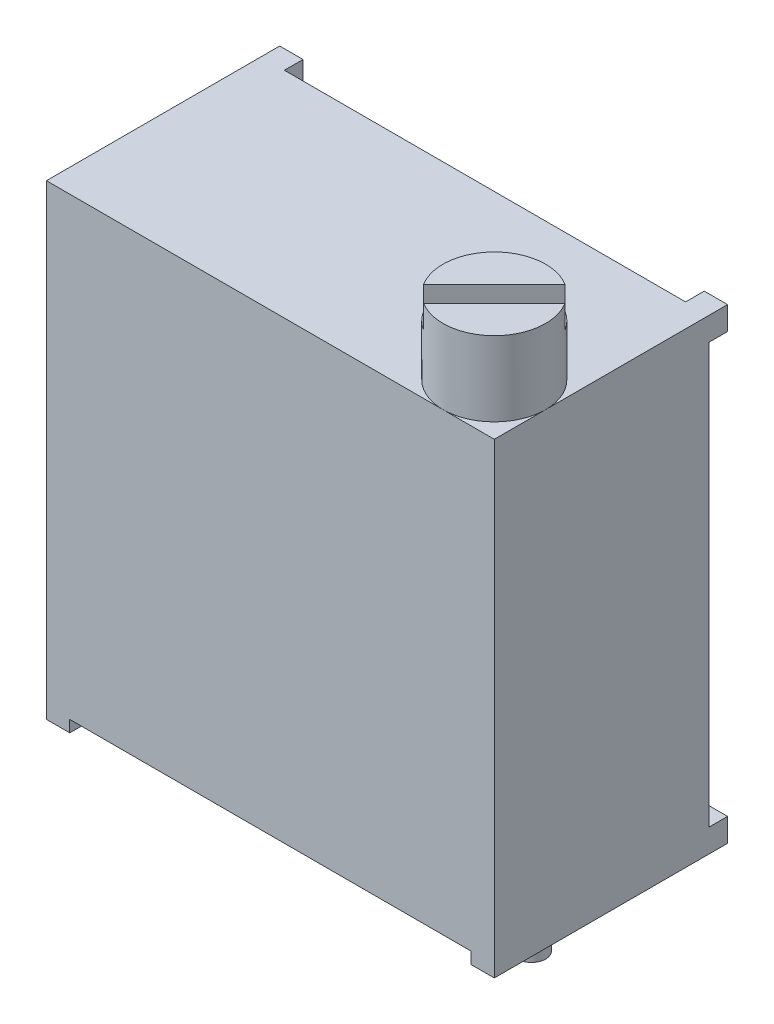
ISO-10303-21;
HEADER;
FILE_DESCRIPTION(('STEP AP214'),'2;1');
FILE_NAME('part.step','',(''),(''),'','','');
FILE_SCHEMA(('AUTOMOTIVE_DESIGN { 1 0 10303 214 1 1 1 1 }'));
ENDSEC;
DATA;
#1=APPLICATION_CONTEXT('core data for automotive mechanical design processes');
#2=APPLICATION_PROTOCOL_DEFINITION('international standard','automotive_design',2000,#1);
#3=PRODUCT_CONTEXT('',#1,'mechanical');
#4=PRODUCT('Part','Part','',(#3));
#5=PRODUCT_RELATED_PRODUCT_CATEGORY('part','',(#4));
#6=PRODUCT_DEFINITION_FORMATION('','',#4);
#7=PRODUCT_DEFINITION_CONTEXT('part definition',#1,'design');
#8=PRODUCT_DEFINITION('design','',#6,#7);
#9=PRODUCT_DEFINITION_SHAPE('','',#8);
#10=(LENGTH_UNIT() NAMED_UNIT(*) SI_UNIT(.MILLI.,.METRE.));
#11=(NAMED_UNIT(*) PLANE_ANGLE_UNIT() SI_UNIT($,.RADIAN.));
#12=(NAMED_UNIT(*) SI_UNIT($,.STERADIAN.) SOLID_ANGLE_UNIT());
#13=UNCERTAINTY_MEASURE_WITH_UNIT(LENGTH_MEASURE(1.E-05),#10,'distance_accuracy_value','');
#14=(GEOMETRIC_REPRESENTATION_CONTEXT(3) GLOBAL_UNCERTAINTY_ASSIGNED_CONTEXT((#13)) GLOBAL_UNIT_ASSIGNED_CONTEXT((#10,
#11,#12)) REPRESENTATION_CONTEXT('',''));
#15=CARTESIAN_POINT('',(0.,0.,0.));
#16=DIRECTION('',(0.,0.,1.));
#17=DIRECTION('',(1.,0.,0.));
#18=AXIS2_PLACEMENT_3D('',#15,#16,#17);
#19=CARTESIAN_POINT('',(0.165760434326159,11.1,2.48068617508052));
#20=DIRECTION('',(-0.707106781186548,0.,-0.707106781186547));
#21=DIRECTION('',(-0.707106781186547,0.,0.707106781186548));
#22=AXIS2_PLACEMENT_3D('',#19,#20,#21);
#23=PLANE('',#22);
#24=DIRECTION('',(0.,1.,0.));
#25=VECTOR('',#24,1.);
#26=CARTESIAN_POINT('',(0.165760434326159,11.1,2.48068617508052));
#27=LINE('',#26,#25);
#28=CARTESIAN_POINT('',(0.165760434326159,11.1,2.48068617508052));
#29=VERTEX_POINT('',#28);
#30=CARTESIAN_POINT('',(0.165760434326159,11.6,2.48068617508052));
#31=VERTEX_POINT('',#30);
#32=EDGE_CURVE('P0_E55',#29,#31,#27,.T.);
#33=ORIENTED_EDGE('',*,*,#32,.F.);
#34=DIRECTION('',(-0.707106781186547,0.,0.707106781186548));
#35=VECTOR('',#34,1.);
#36=CARTESIAN_POINT('',(1.68068617508046,11.1,0.965760434326203));
#37=LINE('',#36,#35);
#38=CARTESIAN_POINT('',(1.68068617508046,11.1,0.965760434326203));
#39=VERTEX_POINT('',#38);
#40=EDGE_CURVE('P0_E67',#39,#29,#37,.T.);
#41=ORIENTED_EDGE('',*,*,#40,.F.);
#42=DIRECTION('',(0.,1.,0.));
#43=VECTOR('',#42,1.);
#44=CARTESIAN_POINT('',(1.68068617508046,11.1,0.965760434326203));
#45=LINE('',#44,#43);
#46=CARTESIAN_POINT('',(1.68068617508046,11.6,0.965760434326203));
#47=VERTEX_POINT('',#46);
#48=EDGE_CURVE('P0_E72',#47,#39,#45,.F.);
#49=ORIENTED_EDGE('',*,*,#48,.F.);
#50=DIRECTION('',(0.707106781186547,0.,-0.707106781186548));
#51=VECTOR('',#50,1.);
#52=CARTESIAN_POINT('',(0.165760434326159,11.6,2.48068617508052));
#53=LINE('',#52,#51);
#54=EDGE_CURVE('P0_E70',#31,#47,#53,.T.);
#55=ORIENTED_EDGE('',*,*,#54,.F.);
#56=EDGE_LOOP('',(#33,#41,#49,#55));
#57=FACE_BOUND('',#56,.T.);
#58=ADVANCED_FACE('P0_F16',(#57),#23,.F.);
#59=CARTESIAN_POINT('',(1.09999999999995,11.1,1.89999999999998));
#60=DIRECTION('',(0.,1.,0.));
#61=DIRECTION('',(0.,0.,1.));
#62=AXIS2_PLACEMENT_3D('',#59,#60,#61);
#63=PLANE('',#62);
#64=CARTESIAN_POINT('',(1.09999999999995,11.1,1.89999999999998));
#65=DIRECTION('',(0.,-1.,0.));
#66=DIRECTION('',(0.,0.,-1.));
#67=AXIS2_PLACEMENT_3D('',#64,#65,#66);
#68=CIRCLE('',#67,1.1);
#69=CARTESIAN_POINT('',(2.03423956567378,11.1,1.31931382491948));
#70=VERTEX_POINT('',#69);
#71=EDGE_CURVE('P0_E63',#70,#39,#68,.F.);
#72=ORIENTED_EDGE('',*,*,#71,.T.);
#73=ORIENTED_EDGE('',*,*,#40,.T.);
#74=CARTESIAN_POINT('',(1.09999999999995,11.1,1.89999999999998));
#75=DIRECTION('',(0.,-1.,0.));
#76=DIRECTION('',(0.,0.,-1.));
#77=AXIS2_PLACEMENT_3D('',#74,#75,#76);
#78=CIRCLE('',#77,1.1);
#79=CARTESIAN_POINT('',(0.519313824919473,11.1,2.83423956567379));
#80=VERTEX_POINT('',#79);
#81=EDGE_CURVE('P0_E19',#29,#80,#78,.F.);
#82=ORIENTED_EDGE('',*,*,#81,.T.);
#83=DIRECTION('',(0.707106781186547,0.,-0.707106781186548));
#84=VECTOR('',#83,1.);
#85=CARTESIAN_POINT('',(2.03423956567378,11.1,1.31931382491948));
#86=LINE('',#85,#84);
#87=EDGE_CURVE('P0_E76',#80,#70,#86,.T.);
#88=ORIENTED_EDGE('',*,*,#87,.T.);
#89=EDGE_LOOP('',(#72,#73,#82,#88));
#90=FACE_BOUND('',#89,.T.);
#91=ADVANCED_FACE('P0_F74',(#90),#63,.T.);
#92=CARTESIAN_POINT('',(1.09999999999995,11.6,1.89999999999998));
#93=DIRECTION('',(0.,1.,0.));
#94=DIRECTION('',(0.,0.,1.));
#95=AXIS2_PLACEMENT_3D('',#92,#93,#94);
#96=PLANE('',#95);
#97=ORIENTED_EDGE('',*,*,#54,.T.);
#98=CARTESIAN_POINT('',(1.09999999999995,11.6,1.89999999999998));
#99=DIRECTION('',(0.,-1.,0.));
#100=DIRECTION('',(0.,0.,-1.));
#101=AXIS2_PLACEMENT_3D('',#98,#99,#100);
#102=CIRCLE('',#101,1.1);
#103=EDGE_CURVE('P0_E83',#31,#47,#102,.T.);
#104=ORIENTED_EDGE('',*,*,#103,.F.);
#105=EDGE_LOOP('',(#97,#104));
#106=FACE_BOUND('',#105,.T.);
#107=ADVANCED_FACE('P0_F103',(#106),#96,.T.);
#108=CARTESIAN_POINT('',(2.03423956567378,11.1,1.31931382491948));
#109=DIRECTION('',(0.707106781186548,0.,0.707106781186547));
#110=DIRECTION('',(0.707106781186547,0.,-0.707106781186548));
#111=AXIS2_PLACEMENT_3D('',#108,#109,#110);
#112=PLANE('',#111);
#113=DIRECTION('',(0.,1.,0.));
#114=VECTOR('',#113,1.);
#115=CARTESIAN_POINT('',(2.03423956567378,11.1,1.31931382491948));
#116=LINE('',#115,#114);
#117=CARTESIAN_POINT('',(2.03423956567378,11.6,1.31931382491948));
#118=VERTEX_POINT('',#117);
#119=EDGE_CURVE('P0_E34',#70,#118,#116,.T.);
#120=ORIENTED_EDGE('',*,*,#119,.F.);
#121=ORIENTED_EDGE('',*,*,#87,.F.);
#122=DIRECTION('',(0.,-1.,0.));
#123=VECTOR('',#122,1.);
#124=CARTESIAN_POINT('',(0.519313824919473,11.6,2.83423956567379));
#125=LINE('',#124,#123);
#126=CARTESIAN_POINT('',(0.519313824919473,11.6,2.83423956567379));
#127=VERTEX_POINT('',#126);
#128=EDGE_CURVE('P0_E58',#127,#80,#125,.T.);
#129=ORIENTED_EDGE('',*,*,#128,.F.);
#130=DIRECTION('',(-0.707106781186547,0.,0.707106781186548));
#131=VECTOR('',#130,1.);
#132=CARTESIAN_POINT('',(2.03423956567378,11.6,1.31931382491948));
#133=LINE('',#132,#131);
#134=EDGE_CURVE('P0_E82',#118,#127,#133,.T.);
#135=ORIENTED_EDGE('',*,*,#134,.F.);
#136=EDGE_LOOP('',(#120,#121,#129,#135));
#137=FACE_BOUND('',#136,.T.);
#138=ADVANCED_FACE('P0_F89',(#137),#112,.F.);
#139=CARTESIAN_POINT('',(1.09999999999995,11.6,1.89999999999998));
#140=DIRECTION('',(0.,1.,0.));
#141=DIRECTION('',(0.,0.,1.));
#142=AXIS2_PLACEMENT_3D('',#139,#140,#141);
#143=PLANE('',#142);
#144=ORIENTED_EDGE('',*,*,#134,.T.);
#145=CARTESIAN_POINT('',(1.09999999999995,11.6,1.89999999999998));
#146=DIRECTION('',(0.,-1.,0.));
#147=DIRECTION('',(0.,0.,-1.));
#148=AXIS2_PLACEMENT_3D('',#145,#146,#147);
#149=CIRCLE('',#148,1.1);
#150=EDGE_CURVE('P0_E25',#118,#127,#149,.T.);
#151=ORIENTED_EDGE('',*,*,#150,.F.);
#152=EDGE_LOOP('',(#144,#151));
#153=FACE_BOUND('',#152,.T.);
#154=ADVANCED_FACE('P0_F92',(#153),#143,.T.);
#155=CARTESIAN_POINT('',(1.09999999999995,10.,1.89999999999998));
#156=DIRECTION('',(0.,1.,0.));
#157=DIRECTION('',(0.,0.,1.));
#158=AXIS2_PLACEMENT_3D('',#155,#156,#157);
#159=PLANE('',#158);
#160=CARTESIAN_POINT('',(1.09999999999995,10.,1.89999999999998));
#161=DIRECTION('',(0.,-1.,0.));
#162=DIRECTION('',(0.,0.,-1.));
#163=AXIS2_PLACEMENT_3D('',#160,#161,#162);
#164=CIRCLE('',#163,1.1);
#165=CARTESIAN_POINT('',(1.09999999999995,10.,0.799999999999978));
#166=VERTEX_POINT('',#165);
#167=EDGE_CURVE('P0_E11',#166,#166,#164,.F.);
#168=ORIENTED_EDGE('',*,*,#167,.F.);
#169=EDGE_LOOP('',(#168));
#170=FACE_BOUND('',#169,.T.);
#171=ADVANCED_FACE('P0_F94',(#170),#159,.F.);
#172=CARTESIAN_POINT('',(1.09999999999995,11.6,1.89999999999998));
#173=DIRECTION('',(0.,-1.,0.));
#174=DIRECTION('',(0.,0.,-1.));
#175=AXIS2_PLACEMENT_3D('',#172,#173,#174);
#176=CYLINDRICAL_SURFACE('',#175,1.1);
#177=ORIENTED_EDGE('',*,*,#150,.T.);
#178=ORIENTED_EDGE('',*,*,#128,.T.);
#179=ORIENTED_EDGE('',*,*,#81,.F.);
#180=ORIENTED_EDGE('',*,*,#32,.T.);
#181=ORIENTED_EDGE('',*,*,#103,.T.);
#182=ORIENTED_EDGE('',*,*,#48,.T.);
#183=ORIENTED_EDGE('',*,*,#71,.F.);
#184=ORIENTED_EDGE('',*,*,#119,.T.);
#185=EDGE_LOOP('',(#177,#178,#179,#180,#181,#182,#183,#184));
#186=FACE_BOUND('',#185,.T.);
#187=ORIENTED_EDGE('',*,*,#167,.T.);
#188=EDGE_LOOP('',(#187));
#189=FACE_BOUND('',#188,.T.);
#190=ADVANCED_FACE('P0_F53',(#186,#189),#176,.T.);
#191=CLOSED_SHELL('',(#58,#91,#107,#138,#154,#171,#190));
#192=MANIFOLD_SOLID_BREP('P0_B1',#191);
#193=CARTESIAN_POINT('',(17.6637733676023,-2.09999999999997,7.69999999999981));
#194=DIRECTION('',(0.,1.,0.));
#195=DIRECTION('',(-1.,0.,0.));
#196=AXIS2_PLACEMENT_3D('',#193,#194,#195);
#197=PLANE('',#196);
#198=CARTESIAN_POINT('',(-2.54,-2.1,0.));
#199=DIRECTION('',(0.,1.,0.));
#200=DIRECTION('',(0.,0.,1.));
#201=AXIS2_PLACEMENT_3D('',#198,#199,#200);
#202=CIRCLE('',#201,0.3);
#203=CARTESIAN_POINT('',(-2.54,-2.1,0.299999999999972));
#204=VERTEX_POINT('',#203);
#205=EDGE_CURVE('P1_E19',#204,#204,#202,.T.);
#206=ORIENTED_EDGE('',*,*,#205,.F.);
#207=EDGE_LOOP('',(#206));
#208=FACE_BOUND('',#207,.T.);
#209=ADVANCED_FACE('P1_F16',(#208),#197,.F.);
#210=CARTESIAN_POINT('',(17.6637733676023,-2.09999999999997,7.69999999999981));
#211=DIRECTION('',(0.,1.,0.));
#212=DIRECTION('',(-1.,0.,0.));
#213=AXIS2_PLACEMENT_3D('',#210,#211,#212);
#214=PLANE('',#213);
#215=CARTESIAN_POINT('',(0.,-2.1,0.));
#216=DIRECTION('',(0.,1.,0.));
#217=DIRECTION('',(0.,0.,1.));
#218=AXIS2_PLACEMENT_3D('',#215,#216,#217);
#219=CIRCLE('',#218,0.3);
#220=CARTESIAN_POINT('',(0.,-2.1,0.3));
#221=VERTEX_POINT('',#220);
#222=EDGE_CURVE('P1_E192',#221,#221,#219,.T.);
#223=ORIENTED_EDGE('',*,*,#222,.F.);
#224=EDGE_LOOP('',(#223));
#225=FACE_BOUND('',#224,.T.);
#226=ADVANCED_FACE('P1_F367',(#225),#214,.F.);
#227=CARTESIAN_POINT('',(17.6637733676023,-2.09999999999997,7.69999999999981));
#228=DIRECTION('',(0.,1.,0.));
#229=DIRECTION('',(-1.,0.,0.));
#230=AXIS2_PLACEMENT_3D('',#227,#228,#229);
#231=PLANE('',#230);
#232=CARTESIAN_POINT('',(-5.08,-2.1,0.));
#233=DIRECTION('',(0.,1.,0.));
#234=DIRECTION('',(0.,0.,1.));
#235=AXIS2_PLACEMENT_3D('',#232,#233,#234);
#236=CIRCLE('',#235,0.3);
#237=CARTESIAN_POINT('',(-5.08,-2.1,0.3));
#238=VERTEX_POINT('',#237);
#239=EDGE_CURVE('P1_E189',#238,#238,#236,.T.);
#240=ORIENTED_EDGE('',*,*,#239,.F.);
#241=EDGE_LOOP('',(#240));
#242=FACE_BOUND('',#241,.T.);
#243=ADVANCED_FACE('P1_F359',(#242),#231,.F.);
#244=CARTESIAN_POINT('',(2.19999999999995,0.,2.99999999999998));
#245=DIRECTION('',(0.,-1.,0.));
#246=DIRECTION('',(0.,0.,-1.));
#247=AXIS2_PLACEMENT_3D('',#244,#245,#246);
#248=PLANE('',#247);
#249=DIRECTION('',(0.,0.,-1.));
#250=VECTOR('',#249,1.);
#251=CARTESIAN_POINT('',(-7.4,0.,-2.00000000000003));
#252=LINE('',#251,#250);
#253=CARTESIAN_POINT('',(-7.40000000000005,0.,2.99999999999998));
#254=VERTEX_POINT('',#253);
#255=CARTESIAN_POINT('',(-7.4,0.,-2.00000000000003));
#256=VERTEX_POINT('',#255);
#257=EDGE_CURVE('P1_E311',#254,#256,#252,.T.);
#258=ORIENTED_EDGE('',*,*,#257,.T.);
#259=DIRECTION('',(1.,0.,0.));
#260=VECTOR('',#259,1.);
#261=CARTESIAN_POINT('',(2.19999999999999,0.,-2.00000000000003));
#262=LINE('',#261,#260);
#263=CARTESIAN_POINT('',(-6.9,0.,-2.));
#264=VERTEX_POINT('',#263);
#265=EDGE_CURVE('P1_E172',#256,#264,#262,.T.);
#266=ORIENTED_EDGE('',*,*,#265,.T.);
#267=DIRECTION('',(0.,0.,-1.));
#268=VECTOR('',#267,1.);
#269=CARTESIAN_POINT('',(-6.9,0.,-1.6));
#270=LINE('',#269,#268);
#271=CARTESIAN_POINT('',(-6.90000000000004,0.,3.));
#272=VERTEX_POINT('',#271);
#273=EDGE_CURVE('P1_E194',#272,#264,#270,.T.);
#274=ORIENTED_EDGE('',*,*,#273,.F.);
#275=DIRECTION('',(1.,0.,0.));
#276=VECTOR('',#275,1.);
#277=CARTESIAN_POINT('',(2.19999999999995,0.,2.99999999999998));
#278=LINE('',#277,#276);
#279=EDGE_CURVE('P1_E174',#272,#254,#278,.F.);
#280=ORIENTED_EDGE('',*,*,#279,.T.);
#281=EDGE_LOOP('',(#258,#266,#274,#280));
#282=FACE_BOUND('',#281,.T.);
#283=ADVANCED_FACE('P1_F357',(#282),#248,.T.);
#284=CARTESIAN_POINT('',(2.19999999999999,10.,-2.00000000000002));
#285=DIRECTION('',(0.,0.,1.));
#286=DIRECTION('',(1.,0.,0.));
#287=AXIS2_PLACEMENT_3D('',#284,#285,#286);
#288=PLANE('',#287);
#289=ORIENTED_EDGE('',*,*,#265,.F.);
#290=DIRECTION('',(0.,1.,0.));
#291=VECTOR('',#290,1.);
#292=CARTESIAN_POINT('',(-7.4,10.,-2.00000000000002));
#293=LINE('',#292,#291);
#294=CARTESIAN_POINT('',(-7.4,0.5,-2.00000000000003));
#295=VERTEX_POINT('',#294);
#296=EDGE_CURVE('P1_E309',#256,#295,#293,.T.);
#297=ORIENTED_EDGE('',*,*,#296,.T.);
#298=DIRECTION('',(-1.,0.,0.));
#299=VECTOR('',#298,1.);
#300=CARTESIAN_POINT('',(-7.4,0.5,-2.00000000000003));
#301=LINE('',#300,#299);
#302=CARTESIAN_POINT('',(-6.9,0.5,-2.));
#303=VERTEX_POINT('',#302);
#304=EDGE_CURVE('P1_E155',#303,#295,#301,.T.);
#305=ORIENTED_EDGE('',*,*,#304,.F.);
#306=DIRECTION('',(0.,1.,0.));
#307=VECTOR('',#306,1.);
#308=CARTESIAN_POINT('',(-6.9,0.,-2.));
#309=LINE('',#308,#307);
#310=EDGE_CURVE('P1_E210',#264,#303,#309,.T.);
#311=ORIENTED_EDGE('',*,*,#310,.F.);
#312=EDGE_LOOP('',(#289,#297,#305,#311));
#313=FACE_BOUND('',#312,.T.);
#314=ADVANCED_FACE('P1_F356',(#313),#288,.F.);
#315=CARTESIAN_POINT('',(-7.4,0.5,-1.60000000000002));
#316=DIRECTION('',(0.,1.,0.));
#317=DIRECTION('',(-1.,0.,0.));
#318=AXIS2_PLACEMENT_3D('',#315,#316,#317);
#319=PLANE('',#318);
#320=DIRECTION('',(-1.,0.,0.));
#321=VECTOR('',#320,1.);
#322=CARTESIAN_POINT('',(-2.6,0.5,-1.60000000000002));
#323=LINE('',#322,#321);
#324=CARTESIAN_POINT('',(-6.9,0.5,-1.6));
#325=VERTEX_POINT('',#324);
#326=CARTESIAN_POINT('',(-7.4,0.5,-1.60000000000002));
#327=VERTEX_POINT('',#326);
#328=EDGE_CURVE('P1_E223',#325,#327,#323,.T.);
#329=ORIENTED_EDGE('',*,*,#328,.F.);
#330=DIRECTION('',(0.,0.,-1.));
#331=VECTOR('',#330,1.);
#332=CARTESIAN_POINT('',(-6.9,0.5,-1.6));
#333=LINE('',#332,#331);
#334=EDGE_CURVE('P1_E208',#303,#325,#333,.F.);
#335=ORIENTED_EDGE('',*,*,#334,.F.);
#336=ORIENTED_EDGE('',*,*,#304,.T.);
#337=DIRECTION('',(0.,0.,-1.));
#338=VECTOR('',#337,1.);
#339=CARTESIAN_POINT('',(-7.4,0.5,-2.00000000000003));
#340=LINE('',#339,#338);
#341=EDGE_CURVE('P1_E306',#295,#327,#340,.F.);
#342=ORIENTED_EDGE('',*,*,#341,.T.);
#343=EDGE_LOOP('',(#329,#335,#336,#342));
#344=FACE_BOUND('',#343,.T.);
#345=ADVANCED_FACE('P1_F353',(#344),#319,.T.);
#346=CARTESIAN_POINT('',(-7.4,9.5,-1.60000000000002));
#347=DIRECTION('',(0.,-1.,0.));
#348=DIRECTION('',(1.,0.,0.));
#349=AXIS2_PLACEMENT_3D('',#346,#347,#348);
#350=PLANE('',#349);
#351=DIRECTION('',(-1.,0.,0.));
#352=VECTOR('',#351,1.);
#353=CARTESIAN_POINT('',(-2.6,9.5,-1.60000000000002));
#354=LINE('',#353,#352);
#355=CARTESIAN_POINT('',(-7.4,9.5,-1.60000000000002));
#356=VERTEX_POINT('',#355);
#357=CARTESIAN_POINT('',(-6.9,9.5,-1.6));
#358=VERTEX_POINT('',#357);
#359=EDGE_CURVE('P1_E221',#356,#358,#354,.F.);
#360=ORIENTED_EDGE('',*,*,#359,.F.);
#361=DIRECTION('',(0.,0.,-1.));
#362=VECTOR('',#361,1.);
#363=CARTESIAN_POINT('',(-7.4,9.5,-2.00000000000002));
#364=LINE('',#363,#362);
#365=CARTESIAN_POINT('',(-7.4,9.5,-2.00000000000002));
#366=VERTEX_POINT('',#365);
#367=EDGE_CURVE('P1_E150',#356,#366,#364,.T.);
#368=ORIENTED_EDGE('',*,*,#367,.T.);
#369=DIRECTION('',(1.,0.,0.));
#370=VECTOR('',#369,1.);
#371=CARTESIAN_POINT('',(2.19999999999999,9.5,-2.00000000000002));
#372=LINE('',#371,#370);
#373=CARTESIAN_POINT('',(-6.9,9.5,-1.99999999999999));
#374=VERTEX_POINT('',#373);
#375=EDGE_CURVE('P1_E144',#366,#374,#372,.T.);
#376=ORIENTED_EDGE('',*,*,#375,.T.);
#377=DIRECTION('',(0.,0.,1.));
#378=VECTOR('',#377,1.);
#379=CARTESIAN_POINT('',(-6.9,9.5,-1.6));
#380=LINE('',#379,#378);
#381=EDGE_CURVE('P1_E147',#358,#374,#380,.F.);
#382=ORIENTED_EDGE('',*,*,#381,.F.);
#383=EDGE_LOOP('',(#360,#368,#376,#382));
#384=FACE_BOUND('',#383,.T.);
#385=ADVANCED_FACE('P1_F146',(#384),#350,.T.);
#386=CARTESIAN_POINT('',(2.19999999999999,10.,-2.00000000000002));
#387=DIRECTION('',(0.,0.,1.));
#388=DIRECTION('',(1.,0.,0.));
#389=AXIS2_PLACEMENT_3D('',#386,#387,#388);
#390=PLANE('',#389);
#391=DIRECTION('',(0.,1.,0.));
#392=VECTOR('',#391,1.);
#393=CARTESIAN_POINT('',(-7.4,10.,-2.00000000000002));
#394=LINE('',#393,#392);
#395=CARTESIAN_POINT('',(-7.4,10.,-2.00000000000002));
#396=VERTEX_POINT('',#395);
#397=EDGE_CURVE('P1_E191',#366,#396,#394,.T.);
#398=ORIENTED_EDGE('',*,*,#397,.T.);
#399=DIRECTION('',(1.,0.,0.));
#400=VECTOR('',#399,1.);
#401=CARTESIAN_POINT('',(2.19999999999999,10.,-2.00000000000002));
#402=LINE('',#401,#400);
#403=CARTESIAN_POINT('',(-6.9,10.,-1.99999999999999));
#404=VERTEX_POINT('',#403);
#405=EDGE_CURVE('P1_E167',#396,#404,#402,.T.);
#406=ORIENTED_EDGE('',*,*,#405,.T.);
#407=DIRECTION('',(0.,1.,0.));
#408=VECTOR('',#407,1.);
#409=CARTESIAN_POINT('',(-6.9,10.,-1.99999999999999));
#410=LINE('',#409,#408);
#411=EDGE_CURVE('P1_E154',#374,#404,#410,.T.);
#412=ORIENTED_EDGE('',*,*,#411,.F.);
#413=ORIENTED_EDGE('',*,*,#375,.F.);
#414=EDGE_LOOP('',(#398,#406,#412,#413));
#415=FACE_BOUND('',#414,.T.);
#416=ADVANCED_FACE('P1_F165',(#415),#390,.F.);
#417=CARTESIAN_POINT('',(-6.9,10.,-1.6));
#418=DIRECTION('',(1.,0.,0.));
#419=DIRECTION('',(0.,1.,0.));
#420=AXIS2_PLACEMENT_3D('',#417,#418,#419);
#421=PLANE('',#420);
#422=DIRECTION('',(0.,1.,0.));
#423=VECTOR('',#422,1.);
#424=CARTESIAN_POINT('',(-6.9,5.,-1.6));
#425=LINE('',#424,#423);
#426=CARTESIAN_POINT('',(-6.9,10.,-1.6));
#427=VERTEX_POINT('',#426);
#428=EDGE_CURVE('P1_E161',#358,#427,#425,.T.);
#429=ORIENTED_EDGE('',*,*,#428,.F.);
#430=ORIENTED_EDGE('',*,*,#381,.T.);
#431=ORIENTED_EDGE('',*,*,#411,.T.);
#432=DIRECTION('',(0.,0.,-1.));
#433=VECTOR('',#432,1.);
#434=CARTESIAN_POINT('',(-6.90000000000004,10.,3.));
#435=LINE('',#434,#433);
#436=EDGE_CURVE('P1_E294',#404,#427,#435,.F.);
#437=ORIENTED_EDGE('',*,*,#436,.T.);
#438=EDGE_LOOP('',(#429,#430,#431,#437));
#439=FACE_BOUND('',#438,.T.);
#440=ADVANCED_FACE('P1_F158',(#439),#421,.T.);
#441=CARTESIAN_POINT('',(1.70000000000001,10.,-1.6));
#442=DIRECTION('',(-1.,0.,0.));
#443=DIRECTION('',(0.,0.,1.));
#444=AXIS2_PLACEMENT_3D('',#441,#442,#443);
#445=PLANE('',#444);
#446=DIRECTION('',(0.,1.,0.));
#447=VECTOR('',#446,1.);
#448=CARTESIAN_POINT('',(1.70000000000001,5.,-1.60000000000001));
#449=LINE('',#448,#447);
#450=CARTESIAN_POINT('',(1.70000000000001,10.,-1.6));
#451=VERTEX_POINT('',#450);
#452=CARTESIAN_POINT('',(1.70000000000001,9.5,-1.6));
#453=VERTEX_POINT('',#452);
#454=EDGE_CURVE('P1_E218',#451,#453,#449,.F.);
#455=ORIENTED_EDGE('',*,*,#454,.F.);
#456=DIRECTION('',(0.,0.,-1.));
#457=VECTOR('',#456,1.);
#458=CARTESIAN_POINT('',(1.69999999999995,10.,3.));
#459=LINE('',#458,#457);
#460=CARTESIAN_POINT('',(1.69999999999999,10.,-2.));
#461=VERTEX_POINT('',#460);
#462=EDGE_CURVE('P1_E289',#451,#461,#459,.T.);
#463=ORIENTED_EDGE('',*,*,#462,.T.);
#464=DIRECTION('',(0.,1.,0.));
#465=VECTOR('',#464,1.);
#466=CARTESIAN_POINT('',(1.69999999999999,10.,-2.));
#467=LINE('',#466,#465);
#468=CARTESIAN_POINT('',(1.69999999999999,9.5,-2.));
#469=VERTEX_POINT('',#468);
#470=EDGE_CURVE('P1_E138',#461,#469,#467,.F.);
#471=ORIENTED_EDGE('',*,*,#470,.T.);
#472=DIRECTION('',(0.,0.,-1.));
#473=VECTOR('',#472,1.);
#474=CARTESIAN_POINT('',(1.70000000000001,9.5,-1.6));
#475=LINE('',#474,#473);
#476=EDGE_CURVE('P1_E237',#453,#469,#475,.T.);
#477=ORIENTED_EDGE('',*,*,#476,.F.);
#478=EDGE_LOOP('',(#455,#463,#471,#477));
#479=FACE_BOUND('',#478,.T.);
#480=ADVANCED_FACE('P1_F349',(#479),#445,.T.);
#481=CARTESIAN_POINT('',(2.19999999999999,10.,-2.00000000000002));
#482=DIRECTION('',(0.,0.,1.));
#483=DIRECTION('',(1.,0.,0.));
#484=AXIS2_PLACEMENT_3D('',#481,#482,#483);
#485=PLANE('',#484);
#486=DIRECTION('',(0.,1.,0.));
#487=VECTOR('',#486,1.);
#488=CARTESIAN_POINT('',(2.19999999999999,10.,-2.00000000000002));
#489=LINE('',#488,#487);
#490=CARTESIAN_POINT('',(2.19999999999999,0.5,-2.00000000000003));
#491=VERTEX_POINT('',#490);
#492=CARTESIAN_POINT('',(2.19999999999999,0.,-2.00000000000003));
#493=VERTEX_POINT('',#492);
#494=EDGE_CURVE('P1_E286',#491,#493,#489,.F.);
#495=ORIENTED_EDGE('',*,*,#494,.T.);
#496=DIRECTION('',(1.,0.,0.));
#497=VECTOR('',#496,1.);
#498=CARTESIAN_POINT('',(2.19999999999999,0.,-2.00000000000003));
#499=LINE('',#498,#497);
#500=CARTESIAN_POINT('',(1.69999999999999,0.,-2.00000000000002));
#501=VERTEX_POINT('',#500);
#502=EDGE_CURVE('P1_E242',#501,#493,#499,.T.);
#503=ORIENTED_EDGE('',*,*,#502,.F.);
#504=DIRECTION('',(0.,1.,0.));
#505=VECTOR('',#504,1.);
#506=CARTESIAN_POINT('',(1.69999999999999,0.,-2.00000000000002));
#507=LINE('',#506,#505);
#508=CARTESIAN_POINT('',(1.69999999999999,0.5,-2.00000000000002));
#509=VERTEX_POINT('',#508);
#510=EDGE_CURVE('P1_E233',#509,#501,#507,.F.);
#511=ORIENTED_EDGE('',*,*,#510,.F.);
#512=DIRECTION('',(1.,0.,0.));
#513=VECTOR('',#512,1.);
#514=CARTESIAN_POINT('',(2.19999999999999,0.5,-2.00000000000003));
#515=LINE('',#514,#513);
#516=EDGE_CURVE('P1_E235',#491,#509,#515,.F.);
#517=ORIENTED_EDGE('',*,*,#516,.F.);
#518=EDGE_LOOP('',(#495,#503,#511,#517));
#519=FACE_BOUND('',#518,.T.);
#520=ADVANCED_FACE('P1_F340',(#519),#485,.F.);
#521=CARTESIAN_POINT('',(2.19999999999995,0.,2.99999999999998));
#522=DIRECTION('',(0.,-1.,0.));
#523=DIRECTION('',(0.,0.,-1.));
#524=AXIS2_PLACEMENT_3D('',#521,#522,#523);
#525=PLANE('',#524);
#526=ORIENTED_EDGE('',*,*,#502,.T.);
#527=DIRECTION('',(0.,0.,1.));
#528=VECTOR('',#527,1.);
#529=CARTESIAN_POINT('',(2.19999999999999,0.,-2.00000000000003));
#530=LINE('',#529,#528);
#531=CARTESIAN_POINT('',(2.19999999999995,0.,2.99999999999998));
#532=VERTEX_POINT('',#531);
#533=EDGE_CURVE('P1_E248',#493,#532,#530,.T.);
#534=ORIENTED_EDGE('',*,*,#533,.T.);
#535=DIRECTION('',(1.,0.,0.));
#536=VECTOR('',#535,1.);
#537=CARTESIAN_POINT('',(2.19999999999995,0.,2.99999999999998));
#538=LINE('',#537,#536);
#539=CARTESIAN_POINT('',(1.69999999999995,0.,2.99999999999998));
#540=VERTEX_POINT('',#539);
#541=EDGE_CURVE('P1_E162',#532,#540,#538,.F.);
#542=ORIENTED_EDGE('',*,*,#541,.T.);
#543=DIRECTION('',(0.,0.,1.));
#544=VECTOR('',#543,1.);
#545=CARTESIAN_POINT('',(1.70000000000001,0.,-1.60000000000002));
#546=LINE('',#545,#544);
#547=EDGE_CURVE('P1_E230',#501,#540,#546,.T.);
#548=ORIENTED_EDGE('',*,*,#547,.F.);
#549=EDGE_LOOP('',(#526,#534,#542,#548));
#550=FACE_BOUND('',#549,.T.);
#551=ADVANCED_FACE('P1_F246',(#550),#525,.T.);
#552=CARTESIAN_POINT('',(2.19999999999999,10.,-2.00000000000002));
#553=DIRECTION('',(0.,0.,1.));
#554=DIRECTION('',(1.,0.,0.));
#555=AXIS2_PLACEMENT_3D('',#552,#553,#554);
#556=PLANE('',#555);
#557=DIRECTION('',(1.,0.,0.));
#558=VECTOR('',#557,1.);
#559=CARTESIAN_POINT('',(2.19999999999999,10.,-2.00000000000002));
#560=LINE('',#559,#558);
#561=CARTESIAN_POINT('',(2.19999999999999,10.,-2.00000000000002));
#562=VERTEX_POINT('',#561);
#563=EDGE_CURVE('P1_E300',#461,#562,#560,.T.);
#564=ORIENTED_EDGE('',*,*,#563,.T.);
#565=DIRECTION('',(0.,1.,0.));
#566=VECTOR('',#565,1.);
#567=CARTESIAN_POINT('',(2.19999999999999,10.,-2.00000000000002));
#568=LINE('',#567,#566);
#569=CARTESIAN_POINT('',(2.19999999999999,9.5,-2.00000000000002));
#570=VERTEX_POINT('',#569);
#571=EDGE_CURVE('P1_E279',#562,#570,#568,.F.);
#572=ORIENTED_EDGE('',*,*,#571,.T.);
#573=DIRECTION('',(1.,0.,0.));
#574=VECTOR('',#573,1.);
#575=CARTESIAN_POINT('',(2.19999999999999,9.5,-2.00000000000002));
#576=LINE('',#575,#574);
#577=EDGE_CURVE('P1_E239',#469,#570,#576,.T.);
#578=ORIENTED_EDGE('',*,*,#577,.F.);
#579=ORIENTED_EDGE('',*,*,#470,.F.);
#580=EDGE_LOOP('',(#564,#572,#578,#579));
#581=FACE_BOUND('',#580,.T.);
#582=ADVANCED_FACE('P1_F407',(#581),#556,.F.);
#583=CARTESIAN_POINT('',(2.19999999999999,9.5,-1.60000000000002));
#584=DIRECTION('',(0.,-1.,0.));
#585=DIRECTION('',(0.,0.,-1.));
#586=AXIS2_PLACEMENT_3D('',#583,#584,#585);
#587=PLANE('',#586);
#588=DIRECTION('',(-1.,0.,0.));
#589=VECTOR('',#588,1.);
#590=CARTESIAN_POINT('',(-2.6,9.5,-1.60000000000002));
#591=LINE('',#590,#589);
#592=CARTESIAN_POINT('',(2.19999999999999,9.5,-1.60000000000002));
#593=VERTEX_POINT('',#592);
#594=EDGE_CURVE('P1_E216',#453,#593,#591,.F.);
#595=ORIENTED_EDGE('',*,*,#594,.F.);
#596=ORIENTED_EDGE('',*,*,#476,.T.);
#597=ORIENTED_EDGE('',*,*,#577,.T.);
#598=DIRECTION('',(0.,0.,1.));
#599=VECTOR('',#598,1.);
#600=CARTESIAN_POINT('',(2.19999999999999,9.5,-2.00000000000002));
#601=LINE('',#600,#599);
#602=EDGE_CURVE('P1_E276',#570,#593,#601,.T.);
#603=ORIENTED_EDGE('',*,*,#602,.T.);
#604=EDGE_LOOP('',(#595,#596,#597,#603));
#605=FACE_BOUND('',#604,.T.);
#606=ADVANCED_FACE('P1_F404',(#605),#587,.T.);
#607=CARTESIAN_POINT('',(2.19999999999999,0.5,-1.60000000000002));
#608=DIRECTION('',(0.,1.,0.));
#609=DIRECTION('',(0.,0.,1.));
#610=AXIS2_PLACEMENT_3D('',#607,#608,#609);
#611=PLANE('',#610);
#612=DIRECTION('',(-1.,0.,0.));
#613=VECTOR('',#612,1.);
#614=CARTESIAN_POINT('',(-2.6,0.5,-1.60000000000002));
#615=LINE('',#614,#613);
#616=CARTESIAN_POINT('',(2.19999999999999,0.5,-1.60000000000002));
#617=VERTEX_POINT('',#616);
#618=CARTESIAN_POINT('',(1.70000000000001,0.5,-1.60000000000002));
#619=VERTEX_POINT('',#618);
#620=EDGE_CURVE('P1_E214',#617,#619,#615,.T.);
#621=ORIENTED_EDGE('',*,*,#620,.F.);
#622=DIRECTION('',(0.,0.,1.));
#623=VECTOR('',#622,1.);
#624=CARTESIAN_POINT('',(2.19999999999999,0.5,-2.00000000000003));
#625=LINE('',#624,#623);
#626=EDGE_CURVE('P1_E188',#617,#491,#625,.F.);
#627=ORIENTED_EDGE('',*,*,#626,.T.);
#628=ORIENTED_EDGE('',*,*,#516,.T.);
#629=DIRECTION('',(0.,0.,1.));
#630=VECTOR('',#629,1.);
#631=CARTESIAN_POINT('',(1.70000000000001,0.5,-1.60000000000002));
#632=LINE('',#631,#630);
#633=EDGE_CURVE('P1_E225',#619,#509,#632,.F.);
#634=ORIENTED_EDGE('',*,*,#633,.F.);
#635=EDGE_LOOP('',(#621,#627,#628,#634));
#636=FACE_BOUND('',#635,.T.);
#637=ADVANCED_FACE('P1_F400',(#636),#611,.T.);
#638=CARTESIAN_POINT('',(-2.54,-2.75,0.));
#639=DIRECTION('',(0.,1.,0.));
#640=DIRECTION('',(0.,0.,1.));
#641=AXIS2_PLACEMENT_3D('',#638,#639,#640);
#642=CYLINDRICAL_SURFACE('',#641,0.3);
#643=ORIENTED_EDGE('',*,*,#205,.T.);
#644=EDGE_LOOP('',(#643));
#645=FACE_BOUND('',#644,.T.);
#646=CARTESIAN_POINT('',(-2.54,0.25,0.));
#647=DIRECTION('',(0.,1.,0.));
#648=DIRECTION('',(0.,0.,1.));
#649=AXIS2_PLACEMENT_3D('',#646,#647,#648);
#650=CIRCLE('',#649,0.3);
#651=CARTESIAN_POINT('',(-2.54,0.25,0.299999999999972));
#652=VERTEX_POINT('',#651);
#653=EDGE_CURVE('P1_E184',#652,#652,#650,.F.);
#654=ORIENTED_EDGE('',*,*,#653,.T.);
#655=EDGE_LOOP('',(#654));
#656=FACE_BOUND('',#655,.T.);
#657=ADVANCED_FACE('P1_F397',(#645,#656),#642,.T.);
#658=CARTESIAN_POINT('',(1.70000000000001,0.,-1.60000000000002));
#659=DIRECTION('',(-1.,0.,0.));
#660=DIRECTION('',(0.,0.,1.));
#661=AXIS2_PLACEMENT_3D('',#658,#659,#660);
#662=PLANE('',#661);
#663=DIRECTION('',(0.,1.,0.));
#664=VECTOR('',#663,1.);
#665=CARTESIAN_POINT('',(1.70000000000001,5.,-1.60000000000001));
#666=LINE('',#665,#664);
#667=CARTESIAN_POINT('',(1.70000000000001,0.25,-1.60000000000002));
#668=VERTEX_POINT('',#667);
#669=EDGE_CURVE('P1_E212',#619,#668,#666,.F.);
#670=ORIENTED_EDGE('',*,*,#669,.F.);
#671=ORIENTED_EDGE('',*,*,#633,.T.);
#672=ORIENTED_EDGE('',*,*,#510,.T.);
#673=ORIENTED_EDGE('',*,*,#547,.T.);
#674=DIRECTION('',(0.,1.,0.));
#675=VECTOR('',#674,1.);
#676=CARTESIAN_POINT('',(1.69999999999995,0.,2.99999999999998));
#677=LINE('',#676,#675);
#678=CARTESIAN_POINT('',(1.69999999999995,0.25,2.99999999999998));
#679=VERTEX_POINT('',#678);
#680=EDGE_CURVE('P1_E228',#540,#679,#677,.T.);
#681=ORIENTED_EDGE('',*,*,#680,.T.);
#682=DIRECTION('',(0.,0.,1.));
#683=VECTOR('',#682,1.);
#684=CARTESIAN_POINT('',(1.69999999999995,0.25,2.99999999999998));
#685=LINE('',#684,#683);
#686=EDGE_CURVE('P1_E187',#679,#668,#685,.F.);
#687=ORIENTED_EDGE('',*,*,#686,.T.);
#688=EDGE_LOOP('',(#670,#671,#672,#673,#681,#687));
#689=FACE_BOUND('',#688,.T.);
#690=ADVANCED_FACE('P1_F254',(#689),#662,.T.);
#691=CARTESIAN_POINT('',(-2.6,5.,-1.60000000000002));
#692=DIRECTION('',(0.,0.,-1.));
#693=DIRECTION('',(-1.,0.,0.));
#694=AXIS2_PLACEMENT_3D('',#691,#692,#693);
#695=PLANE('',#694);
#696=ORIENTED_EDGE('',*,*,#620,.T.);
#697=ORIENTED_EDGE('',*,*,#669,.T.);
#698=DIRECTION('',(1.,0.,0.));
#699=VECTOR('',#698,1.);
#700=CARTESIAN_POINT('',(-6.9,0.25,-1.6));
#701=LINE('',#700,#699);
#702=CARTESIAN_POINT('',(-6.9,0.25,-1.6));
#703=VERTEX_POINT('',#702);
#704=EDGE_CURVE('P1_E266',#668,#703,#701,.F.);
#705=ORIENTED_EDGE('',*,*,#704,.T.);
#706=DIRECTION('',(0.,1.,0.));
#707=VECTOR('',#706,1.);
#708=CARTESIAN_POINT('',(-6.9,0.,-1.6));
#709=LINE('',#708,#707);
#710=EDGE_CURVE('P1_E202',#325,#703,#709,.F.);
#711=ORIENTED_EDGE('',*,*,#710,.F.);
#712=ORIENTED_EDGE('',*,*,#328,.T.);
#713=DIRECTION('',(0.,1.,0.));
#714=VECTOR('',#713,1.);
#715=CARTESIAN_POINT('',(-7.4,10.,-1.60000000000002));
#716=LINE('',#715,#714);
#717=EDGE_CURVE('P1_E303',#327,#356,#716,.T.);
#718=ORIENTED_EDGE('',*,*,#717,.T.);
#719=ORIENTED_EDGE('',*,*,#359,.T.);
#720=ORIENTED_EDGE('',*,*,#428,.T.);
#721=DIRECTION('',(1.,0.,0.));
#722=VECTOR('',#721,1.);
#723=CARTESIAN_POINT('',(2.19999999999999,10.,-1.60000000000002));
#724=LINE('',#723,#722);
#725=EDGE_CURVE('P1_E291',#427,#451,#724,.T.);
#726=ORIENTED_EDGE('',*,*,#725,.T.);
#727=ORIENTED_EDGE('',*,*,#454,.T.);
#728=ORIENTED_EDGE('',*,*,#594,.T.);
#729=DIRECTION('',(0.,1.,0.));
#730=VECTOR('',#729,1.);
#731=CARTESIAN_POINT('',(2.19999999999999,10.,-1.60000000000002));
#732=LINE('',#731,#730);
#733=EDGE_CURVE('P1_E273',#593,#617,#732,.F.);
#734=ORIENTED_EDGE('',*,*,#733,.T.);
#735=EDGE_LOOP('',(#696,#697,#705,#711,#712,#718,#719,#720,#726,#727,#728,#734));
#736=FACE_BOUND('',#735,.T.);
#737=ADVANCED_FACE('P1_F335',(#736),#695,.T.);
#738=CARTESIAN_POINT('',(-6.9,0.,-1.6));
#739=DIRECTION('',(1.,0.,0.));
#740=DIRECTION('',(0.,0.,-1.));
#741=AXIS2_PLACEMENT_3D('',#738,#739,#740);
#742=PLANE('',#741);
#743=DIRECTION('',(0.,1.,0.));
#744=VECTOR('',#743,1.);
#745=CARTESIAN_POINT('',(-6.90000000000004,0.,3.));
#746=LINE('',#745,#744);
#747=CARTESIAN_POINT('',(-6.90000000000004,0.25,3.));
#748=VERTEX_POINT('',#747);
#749=EDGE_CURVE('P1_E34',#748,#272,#746,.F.);
#750=ORIENTED_EDGE('',*,*,#749,.T.);
#751=ORIENTED_EDGE('',*,*,#273,.T.);
#752=ORIENTED_EDGE('',*,*,#310,.T.);
#753=ORIENTED_EDGE('',*,*,#334,.T.);
#754=ORIENTED_EDGE('',*,*,#710,.T.);
#755=DIRECTION('',(0.,0.,1.));
#756=VECTOR('',#755,1.);
#757=CARTESIAN_POINT('',(-6.90000000000004,0.25,3.));
#758=LINE('',#757,#756);
#759=EDGE_CURVE('P1_E183',#703,#748,#758,.T.);
#760=ORIENTED_EDGE('',*,*,#759,.T.);
#761=EDGE_LOOP('',(#750,#751,#752,#753,#754,#760));
#762=FACE_BOUND('',#761,.T.);
#763=ADVANCED_FACE('P1_F330',(#762),#742,.T.);
#764=CARTESIAN_POINT('',(0.,-2.75,0.));
#765=DIRECTION('',(0.,1.,0.));
#766=DIRECTION('',(0.,0.,1.));
#767=AXIS2_PLACEMENT_3D('',#764,#765,#766);
#768=CYLINDRICAL_SURFACE('',#767,0.3);
#769=ORIENTED_EDGE('',*,*,#222,.T.);
#770=EDGE_LOOP('',(#769));
#771=FACE_BOUND('',#770,.T.);
#772=CARTESIAN_POINT('',(0.,0.25,0.));
#773=DIRECTION('',(0.,1.,0.));
#774=DIRECTION('',(0.,0.,1.));
#775=AXIS2_PLACEMENT_3D('',#772,#773,#774);
#776=CIRCLE('',#775,0.3);
#777=CARTESIAN_POINT('',(0.,0.25,0.3));
#778=VERTEX_POINT('',#777);
#779=EDGE_CURVE('P1_E180',#778,#778,#776,.F.);
#780=ORIENTED_EDGE('',*,*,#779,.T.);
#781=EDGE_LOOP('',(#780));
#782=FACE_BOUND('',#781,.T.);
#783=ADVANCED_FACE('P1_F387',(#771,#782),#768,.T.);
#784=CARTESIAN_POINT('',(-5.08,-2.75,0.));
#785=DIRECTION('',(0.,1.,0.));
#786=DIRECTION('',(0.,0.,1.));
#787=AXIS2_PLACEMENT_3D('',#784,#785,#786);
#788=CYLINDRICAL_SURFACE('',#787,0.3);
#789=ORIENTED_EDGE('',*,*,#239,.T.);
#790=EDGE_LOOP('',(#789));
#791=FACE_BOUND('',#790,.T.);
#792=CARTESIAN_POINT('',(-5.08,0.25,0.));
#793=DIRECTION('',(0.,1.,0.));
#794=DIRECTION('',(0.,0.,1.));
#795=AXIS2_PLACEMENT_3D('',#792,#793,#794);
#796=CIRCLE('',#795,0.3);
#797=CARTESIAN_POINT('',(-5.08,0.25,0.3));
#798=VERTEX_POINT('',#797);
#799=EDGE_CURVE('P1_E176',#798,#798,#796,.F.);
#800=ORIENTED_EDGE('',*,*,#799,.T.);
#801=EDGE_LOOP('',(#800));
#802=FACE_BOUND('',#801,.T.);
#803=ADVANCED_FACE('P1_F384',(#791,#802),#788,.T.);
#804=CARTESIAN_POINT('',(-7.4,10.,-2.00000000000002));
#805=DIRECTION('',(1.,0.,0.));
#806=DIRECTION('',(0.,0.,-1.));
#807=AXIS2_PLACEMENT_3D('',#804,#805,#806);
#808=PLANE('',#807);
#809=ORIENTED_EDGE('',*,*,#717,.F.);
#810=ORIENTED_EDGE('',*,*,#341,.F.);
#811=ORIENTED_EDGE('',*,*,#296,.F.);
#812=ORIENTED_EDGE('',*,*,#257,.F.);
#813=DIRECTION('',(0.,1.,0.));
#814=VECTOR('',#813,1.);
#815=CARTESIAN_POINT('',(-7.40000000000005,10.,2.99999999999998));
#816=LINE('',#815,#814);
#817=CARTESIAN_POINT('',(-7.40000000000005,10.,2.99999999999998));
#818=VERTEX_POINT('',#817);
#819=EDGE_CURVE('P1_E179',#254,#818,#816,.T.);
#820=ORIENTED_EDGE('',*,*,#819,.T.);
#821=DIRECTION('',(0.,0.,-1.));
#822=VECTOR('',#821,1.);
#823=CARTESIAN_POINT('',(-7.40000000000005,10.,2.99999999999998));
#824=LINE('',#823,#822);
#825=EDGE_CURVE('P1_E297',#818,#396,#824,.T.);
#826=ORIENTED_EDGE('',*,*,#825,.T.);
#827=ORIENTED_EDGE('',*,*,#397,.F.);
#828=ORIENTED_EDGE('',*,*,#367,.F.);
#829=EDGE_LOOP('',(#809,#810,#811,#812,#820,#826,#827,#828));
#830=FACE_BOUND('',#829,.T.);
#831=ADVANCED_FACE('P1_F323',(#830),#808,.F.);
#832=CARTESIAN_POINT('',(2.19999999999995,10.,2.99999999999998));
#833=DIRECTION('',(0.,-1.,0.));
#834=DIRECTION('',(0.,0.,-1.));
#835=AXIS2_PLACEMENT_3D('',#832,#833,#834);
#836=PLANE('',#835);
#837=ORIENTED_EDGE('',*,*,#725,.F.);
#838=ORIENTED_EDGE('',*,*,#436,.F.);
#839=ORIENTED_EDGE('',*,*,#405,.F.);
#840=ORIENTED_EDGE('',*,*,#825,.F.);
#841=DIRECTION('',(-1.,0.,0.));
#842=VECTOR('',#841,1.);
#843=CARTESIAN_POINT('',(2.19999999999995,10.,2.99999999999998));
#844=LINE('',#843,#842);
#845=CARTESIAN_POINT('',(2.19999999999995,10.,2.99999999999998));
#846=VERTEX_POINT('',#845);
#847=EDGE_CURVE('P1_E326',#818,#846,#844,.F.);
#848=ORIENTED_EDGE('',*,*,#847,.T.);
#849=DIRECTION('',(0.,0.,1.));
#850=VECTOR('',#849,1.);
#851=CARTESIAN_POINT('',(2.19999999999999,10.,-2.00000000000002));
#852=LINE('',#851,#850);
#853=EDGE_CURVE('P1_E282',#846,#562,#852,.F.);
#854=ORIENTED_EDGE('',*,*,#853,.T.);
#855=ORIENTED_EDGE('',*,*,#563,.F.);
#856=ORIENTED_EDGE('',*,*,#462,.F.);
#857=EDGE_LOOP('',(#837,#838,#839,#840,#848,#854,#855,#856));
#858=FACE_BOUND('',#857,.T.);
#859=ADVANCED_FACE('P1_F318',(#858),#836,.F.);
#860=CARTESIAN_POINT('',(2.19999999999999,10.,-2.00000000000002));
#861=DIRECTION('',(-1.,0.,0.));
#862=DIRECTION('',(0.,0.,1.));
#863=AXIS2_PLACEMENT_3D('',#860,#861,#862);
#864=PLANE('',#863);
#865=ORIENTED_EDGE('',*,*,#733,.F.);
#866=ORIENTED_EDGE('',*,*,#602,.F.);
#867=ORIENTED_EDGE('',*,*,#571,.F.);
#868=ORIENTED_EDGE('',*,*,#853,.F.);
#869=DIRECTION('',(0.,1.,0.));
#870=VECTOR('',#869,1.);
#871=CARTESIAN_POINT('',(2.19999999999995,10.,2.99999999999998));
#872=LINE('',#871,#870);
#873=EDGE_CURVE('P1_E25',#846,#532,#872,.F.);
#874=ORIENTED_EDGE('',*,*,#873,.T.);
#875=ORIENTED_EDGE('',*,*,#533,.F.);
#876=ORIENTED_EDGE('',*,*,#494,.F.);
#877=ORIENTED_EDGE('',*,*,#626,.F.);
#878=EDGE_LOOP('',(#865,#866,#867,#868,#874,#875,#876,#877));
#879=FACE_BOUND('',#878,.T.);
#880=ADVANCED_FACE('P1_F343',(#879),#864,.F.);
#881=CARTESIAN_POINT('',(-6.90000000000004,0.25,3.));
#882=DIRECTION('',(0.,1.,0.));
#883=DIRECTION('',(0.,0.,1.));
#884=AXIS2_PLACEMENT_3D('',#881,#882,#883);
#885=PLANE('',#884);
#886=ORIENTED_EDGE('',*,*,#799,.F.);
#887=EDGE_LOOP('',(#886));
#888=FACE_BOUND('',#887,.T.);
#889=ORIENTED_EDGE('',*,*,#779,.F.);
#890=EDGE_LOOP('',(#889));
#891=FACE_BOUND('',#890,.T.);
#892=ORIENTED_EDGE('',*,*,#704,.F.);
#893=ORIENTED_EDGE('',*,*,#686,.F.);
#894=DIRECTION('',(-1.,0.,0.));
#895=VECTOR('',#894,1.);
#896=CARTESIAN_POINT('',(2.19999999999995,0.25,2.99999999999998));
#897=LINE('',#896,#895);
#898=EDGE_CURVE('P1_E11',#679,#748,#897,.T.);
#899=ORIENTED_EDGE('',*,*,#898,.T.);
#900=ORIENTED_EDGE('',*,*,#759,.F.);
#901=EDGE_LOOP('',(#892,#893,#899,#900));
#902=FACE_BOUND('',#901,.T.);
#903=ORIENTED_EDGE('',*,*,#653,.F.);
#904=EDGE_LOOP('',(#903));
#905=FACE_BOUND('',#904,.T.);
#906=ADVANCED_FACE('P1_F263',(#888,#891,#902,#905),#885,.F.);
#907=CARTESIAN_POINT('',(2.19999999999995,10.,2.99999999999998));
#908=DIRECTION('',(0.,0.,-1.));
#909=DIRECTION('',(-1.,0.,0.));
#910=AXIS2_PLACEMENT_3D('',#907,#908,#909);
#911=PLANE('',#910);
#912=ORIENTED_EDGE('',*,*,#749,.F.);
#913=ORIENTED_EDGE('',*,*,#898,.F.);
#914=ORIENTED_EDGE('',*,*,#680,.F.);
#915=ORIENTED_EDGE('',*,*,#541,.F.);
#916=ORIENTED_EDGE('',*,*,#873,.F.);
#917=ORIENTED_EDGE('',*,*,#847,.F.);
#918=ORIENTED_EDGE('',*,*,#819,.F.);
#919=ORIENTED_EDGE('',*,*,#279,.F.);
#920=EDGE_LOOP('',(#912,#913,#914,#915,#916,#917,#918,#919));
#921=FACE_BOUND('',#920,.T.);
#922=ADVANCED_FACE('P1_F259',(#921),#911,.F.);
#923=CLOSED_SHELL('',(#209,#226,#243,#283,#314,#345,#385,#416,#440,#480,#520,#551,#582,#606,
#637,#657,#690,#737,#763,#783,#803,#831,#859,#880,#906,#922));
#924=MANIFOLD_SOLID_BREP('P1_B1',#923);
#925=ADVANCED_BREP_SHAPE_REPRESENTATION('',(#18,#192,#924),#14);
#926=SHAPE_DEFINITION_REPRESENTATION(#9,#925);
ENDSEC;
END-ISO-10303-21;
